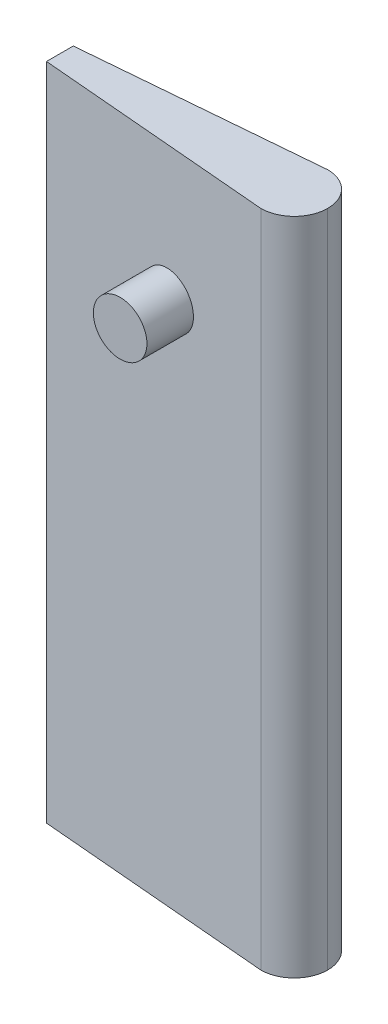
ISO-10303-21;
HEADER;
FILE_DESCRIPTION(('STEP AP214'),'2;1');
FILE_NAME('part.step','',(''),(''),'','','');
FILE_SCHEMA(('AUTOMOTIVE_DESIGN { 1 0 10303 214 1 1 1 1 }'));
ENDSEC;
DATA;
#1=APPLICATION_CONTEXT('core data for automotive mechanical design processes');
#2=APPLICATION_PROTOCOL_DEFINITION('international standard','automotive_design',2000,#1);
#3=PRODUCT_CONTEXT('',#1,'mechanical');
#4=PRODUCT('Part','Part','',(#3));
#5=PRODUCT_RELATED_PRODUCT_CATEGORY('part','',(#4));
#6=PRODUCT_DEFINITION_FORMATION('','',#4);
#7=PRODUCT_DEFINITION_CONTEXT('part definition',#1,'design');
#8=PRODUCT_DEFINITION('design','',#6,#7);
#9=PRODUCT_DEFINITION_SHAPE('','',#8);
#10=(LENGTH_UNIT() NAMED_UNIT(*) SI_UNIT(.MILLI.,.METRE.));
#11=(NAMED_UNIT(*) PLANE_ANGLE_UNIT() SI_UNIT($,.RADIAN.));
#12=(NAMED_UNIT(*) SI_UNIT($,.STERADIAN.) SOLID_ANGLE_UNIT());
#13=UNCERTAINTY_MEASURE_WITH_UNIT(LENGTH_MEASURE(1.E-05),#10,'distance_accuracy_value','');
#14=(GEOMETRIC_REPRESENTATION_CONTEXT(3) GLOBAL_UNCERTAINTY_ASSIGNED_CONTEXT((#13)) GLOBAL_UNIT_ASSIGNED_CONTEXT((#10,
#11,#12)) REPRESENTATION_CONTEXT('',''));
#15=CARTESIAN_POINT('',(0.,0.,0.));
#16=DIRECTION('',(0.,0.,1.));
#17=DIRECTION('',(1.,0.,0.));
#18=AXIS2_PLACEMENT_3D('',#15,#16,#17);
#19=CARTESIAN_POINT('',(-10.,0.,2.5));
#20=DIRECTION('',(0.,1.,0.));
#21=DIRECTION('',(-1.,0.,0.));
#22=AXIS2_PLACEMENT_3D('',#19,#20,#21);
#23=PLANE('',#22);
#24=DIRECTION('',(-0.996346649041751,0.,0.0854011413464362));
#25=VECTOR('',#24,1.);
#26=CARTESIAN_POINT('',(-0.158022690437602,0.,-1.84359805510534));
#27=LINE('',#26,#25);
#28=CARTESIAN_POINT('',(7.50000000000002,0.,-2.5));
#29=VERTEX_POINT('',#28);
#30=CARTESIAN_POINT('',(-10.,0.,-0.999999999999992));
#31=VERTEX_POINT('',#30);
#32=EDGE_CURVE('E63',#29,#31,#27,.T.);
#33=ORIENTED_EDGE('',*,*,#32,.F.);
#34=CARTESIAN_POINT('',(7.5,0.,0.));
#35=DIRECTION('',(0.,1.,0.));
#36=DIRECTION('',(-1.,0.,0.));
#37=AXIS2_PLACEMENT_3D('',#34,#35,#36);
#38=CIRCLE('',#37,2.5);
#39=CARTESIAN_POINT('',(10.,0.,0.));
#40=VERTEX_POINT('',#39);
#41=EDGE_CURVE('E48',#29,#40,#38,.F.);
#42=ORIENTED_EDGE('',*,*,#41,.T.);
#43=CARTESIAN_POINT('',(7.5,0.,0.));
#44=DIRECTION('',(0.,1.,0.));
#45=DIRECTION('',(-1.,0.,0.));
#46=AXIS2_PLACEMENT_3D('',#43,#44,#45);
#47=CIRCLE('',#46,2.5);
#48=CARTESIAN_POINT('',(7.50000000000002,0.,2.5));
#49=VERTEX_POINT('',#48);
#50=EDGE_CURVE('E93',#40,#49,#47,.F.);
#51=ORIENTED_EDGE('',*,*,#50,.T.);
#52=DIRECTION('',(0.996346649041751,0.,0.0854011413464352));
#53=VECTOR('',#52,1.);
#54=CARTESIAN_POINT('',(-0.1580226904376,0.,1.84359805510535));
#55=LINE('',#54,#53);
#56=CARTESIAN_POINT('',(-9.99999999999998,0.,1.00000000000001));
#57=VERTEX_POINT('',#56);
#58=EDGE_CURVE('E116',#57,#49,#55,.T.);
#59=ORIENTED_EDGE('',*,*,#58,.F.);
#60=DIRECTION('',(0.,0.,-1.));
#61=VECTOR('',#60,1.);
#62=CARTESIAN_POINT('',(-10.,0.,2.5));
#63=LINE('',#62,#61);
#64=EDGE_CURVE('E105',#57,#31,#63,.T.);
#65=ORIENTED_EDGE('',*,*,#64,.T.);
#66=EDGE_LOOP('',(#33,#42,#51,#59,#65));
#67=FACE_BOUND('',#66,.T.);
#68=ADVANCED_FACE('F39',(#67),#23,.F.);
#69=CARTESIAN_POINT('',(-10.,0.,2.5));
#70=DIRECTION('',(1.,0.,0.));
#71=DIRECTION('',(0.,1.,0.));
#72=AXIS2_PLACEMENT_3D('',#69,#70,#71);
#73=PLANE('',#72);
#74=DIRECTION('',(0.,1.,0.));
#75=VECTOR('',#74,1.);
#76=CARTESIAN_POINT('',(-9.99999999999998,0.,-0.999999999999992));
#77=LINE('',#76,#75);
#78=CARTESIAN_POINT('',(-9.99999999999998,49.25,-0.999999999999992));
#79=VERTEX_POINT('',#78);
#80=EDGE_CURVE('E101',#31,#79,#77,.T.);
#81=ORIENTED_EDGE('',*,*,#80,.F.);
#82=ORIENTED_EDGE('',*,*,#64,.F.);
#83=DIRECTION('',(0.,1.,0.));
#84=VECTOR('',#83,1.);
#85=CARTESIAN_POINT('',(-9.99999999999998,0.,1.00000000000001));
#86=LINE('',#85,#84);
#87=CARTESIAN_POINT('',(-9.99999999999998,49.25,1.00000000000001));
#88=VERTEX_POINT('',#87);
#89=EDGE_CURVE('E117',#57,#88,#86,.T.);
#90=ORIENTED_EDGE('',*,*,#89,.T.);
#91=DIRECTION('',(0.,0.,-1.));
#92=VECTOR('',#91,1.);
#93=CARTESIAN_POINT('',(-9.99999999999998,49.25,2.5));
#94=LINE('',#93,#92);
#95=EDGE_CURVE('E111',#88,#79,#94,.T.);
#96=ORIENTED_EDGE('',*,*,#95,.T.);
#97=EDGE_LOOP('',(#81,#82,#90,#96));
#98=FACE_BOUND('',#97,.T.);
#99=ADVANCED_FACE('F135',(#98),#73,.F.);
#100=CARTESIAN_POINT('',(-9.99999999999998,49.25,2.5));
#101=DIRECTION('',(0.,-1.,0.));
#102=DIRECTION('',(0.,0.,-1.));
#103=AXIS2_PLACEMENT_3D('',#100,#101,#102);
#104=PLANE('',#103);
#105=CARTESIAN_POINT('',(7.50000000000002,49.25,0.));
#106=DIRECTION('',(0.,-1.,0.));
#107=DIRECTION('',(0.,0.,-1.));
#108=AXIS2_PLACEMENT_3D('',#105,#106,#107);
#109=CIRCLE('',#108,2.5);
#110=CARTESIAN_POINT('',(10.,49.25,0.));
#111=VERTEX_POINT('',#110);
#112=CARTESIAN_POINT('',(7.50000000000002,49.25,-2.5));
#113=VERTEX_POINT('',#112);
#114=EDGE_CURVE('E92',#111,#113,#109,.F.);
#115=ORIENTED_EDGE('',*,*,#114,.T.);
#116=DIRECTION('',(-0.996346649041751,0.,0.0854011413464362));
#117=VECTOR('',#116,1.);
#118=CARTESIAN_POINT('',(-0.158022690437602,49.25,-1.84359805510534));
#119=LINE('',#118,#117);
#120=EDGE_CURVE('E90',#113,#79,#119,.T.);
#121=ORIENTED_EDGE('',*,*,#120,.T.);
#122=ORIENTED_EDGE('',*,*,#95,.F.);
#123=DIRECTION('',(0.996346649041751,0.,0.0854011413464352));
#124=VECTOR('',#123,1.);
#125=CARTESIAN_POINT('',(-0.1580226904376,49.25,1.84359805510535));
#126=LINE('',#125,#124);
#127=CARTESIAN_POINT('',(7.50000000000002,49.25,2.5));
#128=VERTEX_POINT('',#127);
#129=EDGE_CURVE('E54',#88,#128,#126,.T.);
#130=ORIENTED_EDGE('',*,*,#129,.T.);
#131=CARTESIAN_POINT('',(7.50000000000002,49.25,0.));
#132=DIRECTION('',(0.,-1.,0.));
#133=DIRECTION('',(0.,0.,-1.));
#134=AXIS2_PLACEMENT_3D('',#131,#132,#133);
#135=CIRCLE('',#134,2.5);
#136=EDGE_CURVE('E121',#128,#111,#135,.F.);
#137=ORIENTED_EDGE('',*,*,#136,.T.);
#138=EDGE_LOOP('',(#115,#121,#122,#130,#137));
#139=FACE_BOUND('',#138,.T.);
#140=ADVANCED_FACE('F130',(#139),#104,.F.);
#141=CARTESIAN_POINT('',(7.5,0.,0.));
#142=DIRECTION('',(0.,-1.,0.));
#143=DIRECTION('',(1.,0.,0.));
#144=AXIS2_PLACEMENT_3D('',#141,#142,#143);
#145=CYLINDRICAL_SURFACE('',#144,2.5);
#146=DIRECTION('',(0.,1.,0.));
#147=VECTOR('',#146,1.);
#148=CARTESIAN_POINT('',(7.50000000000002,49.25,2.5));
#149=LINE('',#148,#147);
#150=EDGE_CURVE('E11',#49,#128,#149,.T.);
#151=ORIENTED_EDGE('',*,*,#150,.F.);
#152=ORIENTED_EDGE('',*,*,#50,.F.);
#153=DIRECTION('',(0.,1.,0.));
#154=VECTOR('',#153,1.);
#155=CARTESIAN_POINT('',(10.,0.,0.));
#156=LINE('',#155,#154);
#157=EDGE_CURVE('E108',#111,#40,#156,.F.);
#158=ORIENTED_EDGE('',*,*,#157,.F.);
#159=ORIENTED_EDGE('',*,*,#136,.F.);
#160=EDGE_LOOP('',(#151,#152,#158,#159));
#161=FACE_BOUND('',#160,.T.);
#162=ADVANCED_FACE('F41',(#161),#145,.T.);
#163=CARTESIAN_POINT('',(7.5,0.,0.));
#164=DIRECTION('',(0.,1.,0.));
#165=DIRECTION('',(-1.,0.,0.));
#166=AXIS2_PLACEMENT_3D('',#163,#164,#165);
#167=CYLINDRICAL_SURFACE('',#166,2.5);
#168=ORIENTED_EDGE('',*,*,#41,.F.);
#169=DIRECTION('',(0.,1.,0.));
#170=VECTOR('',#169,1.);
#171=CARTESIAN_POINT('',(7.5,0.,-2.5));
#172=LINE('',#171,#170);
#173=EDGE_CURVE('E81',#113,#29,#172,.F.);
#174=ORIENTED_EDGE('',*,*,#173,.F.);
#175=ORIENTED_EDGE('',*,*,#114,.F.);
#176=ORIENTED_EDGE('',*,*,#157,.T.);
#177=EDGE_LOOP('',(#168,#174,#175,#176));
#178=FACE_BOUND('',#177,.T.);
#179=ADVANCED_FACE('F106',(#178),#167,.T.);
#180=CARTESIAN_POINT('',(-0.1580226904376,0.,1.84359805510535));
#181=DIRECTION('',(-0.0854011413464352,0.,0.996346649041751));
#182=DIRECTION('',(0.996346649041751,0.,0.0854011413464352));
#183=AXIS2_PLACEMENT_3D('',#180,#181,#182);
#184=PLANE('',#183);
#185=CARTESIAN_POINT('',(0.,39.25,1.85714285714286));
#186=DIRECTION('',(-0.0854011413464352,0.,0.996346649041751));
#187=DIRECTION('',(-0.996346649041751,0.,-0.0854011413464352));
#188=AXIS2_PLACEMENT_3D('',#185,#186,#187);
#189=ELLIPSE('',#188,2.00733349374289,2.);
#190=CARTESIAN_POINT('',(-2.,39.25,1.68571428571429));
#191=VERTEX_POINT('',#190);
#192=EDGE_CURVE('E119',#191,#191,#189,.F.);
#193=ORIENTED_EDGE('',*,*,#192,.T.);
#194=EDGE_LOOP('',(#193));
#195=FACE_BOUND('',#194,.T.);
#196=ORIENTED_EDGE('',*,*,#129,.F.);
#197=ORIENTED_EDGE('',*,*,#89,.F.);
#198=ORIENTED_EDGE('',*,*,#58,.T.);
#199=ORIENTED_EDGE('',*,*,#150,.T.);
#200=EDGE_LOOP('',(#196,#197,#198,#199));
#201=FACE_BOUND('',#200,.T.);
#202=ADVANCED_FACE('F131',(#195,#201),#184,.T.);
#203=CARTESIAN_POINT('',(-0.158022690437602,0.,-1.84359805510534));
#204=DIRECTION('',(-0.0854011413464362,0.,-0.996346649041751));
#205=DIRECTION('',(-0.996346649041751,0.,0.0854011413464362));
#206=AXIS2_PLACEMENT_3D('',#203,#204,#205);
#207=PLANE('',#206);
#208=CARTESIAN_POINT('',(0.,39.25,-1.85714285714285));
#209=DIRECTION('',(-0.0854011413464362,0.,-0.996346649041751));
#210=DIRECTION('',(0.996346649041751,0.,-0.0854011413464362));
#211=AXIS2_PLACEMENT_3D('',#208,#209,#210);
#212=ELLIPSE('',#211,2.00733349374289,2.);
#213=CARTESIAN_POINT('',(2.,39.25,-2.02857142857143));
#214=VERTEX_POINT('',#213);
#215=EDGE_CURVE('E43',#214,#214,#212,.F.);
#216=ORIENTED_EDGE('',*,*,#215,.T.);
#217=EDGE_LOOP('',(#216));
#218=FACE_BOUND('',#217,.T.);
#219=ORIENTED_EDGE('',*,*,#120,.F.);
#220=ORIENTED_EDGE('',*,*,#173,.T.);
#221=ORIENTED_EDGE('',*,*,#32,.T.);
#222=ORIENTED_EDGE('',*,*,#80,.T.);
#223=EDGE_LOOP('',(#219,#220,#221,#222));
#224=FACE_BOUND('',#223,.T.);
#225=ADVANCED_FACE('F87',(#218,#224),#207,.T.);
#226=CARTESIAN_POINT('',(0.,39.25,-5.5));
#227=DIRECTION('',(0.,0.,1.));
#228=DIRECTION('',(1.,0.,0.));
#229=AXIS2_PLACEMENT_3D('',#226,#227,#228);
#230=PLANE('',#229);
#231=CARTESIAN_POINT('',(0.,39.25,-5.5));
#232=DIRECTION('',(0.,0.,1.));
#233=DIRECTION('',(1.,0.,0.));
#234=AXIS2_PLACEMENT_3D('',#231,#232,#233);
#235=CIRCLE('',#234,2.);
#236=CARTESIAN_POINT('',(2.,39.25,-5.5));
#237=VERTEX_POINT('',#236);
#238=EDGE_CURVE('E233',#237,#237,#235,.T.);
#239=ORIENTED_EDGE('',*,*,#238,.F.);
#240=EDGE_LOOP('',(#239));
#241=FACE_BOUND('',#240,.T.);
#242=ADVANCED_FACE('F145',(#241),#230,.F.);
#243=CARTESIAN_POINT('',(0.,39.25,5.5));
#244=DIRECTION('',(0.,0.,-1.));
#245=DIRECTION('',(-1.,0.,0.));
#246=AXIS2_PLACEMENT_3D('',#243,#244,#245);
#247=CYLINDRICAL_SURFACE('',#246,2.);
#248=ORIENTED_EDGE('',*,*,#215,.F.);
#249=EDGE_LOOP('',(#248));
#250=FACE_BOUND('',#249,.T.);
#251=ORIENTED_EDGE('',*,*,#238,.T.);
#252=EDGE_LOOP('',(#251));
#253=FACE_BOUND('',#252,.T.);
#254=ADVANCED_FACE('F191',(#250,#253),#247,.T.);
#255=ORIENTED_EDGE('',*,*,#192,.F.);
#256=EDGE_LOOP('',(#255));
#257=FACE_BOUND('',#256,.T.);
#258=CARTESIAN_POINT('',(0.,39.25,5.5));
#259=DIRECTION('',(0.,0.,1.));
#260=DIRECTION('',(1.,0.,0.));
#261=AXIS2_PLACEMENT_3D('',#258,#259,#260);
#262=CIRCLE('',#261,2.);
#263=CARTESIAN_POINT('',(2.,39.25,5.5));
#264=VERTEX_POINT('',#263);
#265=EDGE_CURVE('E230',#264,#264,#262,.T.);
#266=ORIENTED_EDGE('',*,*,#265,.F.);
#267=EDGE_LOOP('',(#266));
#268=FACE_BOUND('',#267,.T.);
#269=ADVANCED_FACE('F204',(#257,#268),#247,.T.);
#270=CARTESIAN_POINT('',(0.,39.25,5.5));
#271=DIRECTION('',(0.,0.,1.));
#272=DIRECTION('',(1.,0.,0.));
#273=AXIS2_PLACEMENT_3D('',#270,#271,#272);
#274=PLANE('',#273);
#275=ORIENTED_EDGE('',*,*,#265,.T.);
#276=EDGE_LOOP('',(#275));
#277=FACE_BOUND('',#276,.T.);
#278=ADVANCED_FACE('F211',(#277),#274,.T.);
#279=CLOSED_SHELL('',(#68,#99,#140,#162,#179,#202,#225,#242,#254,#269,#278));
#280=MANIFOLD_SOLID_BREP('B2',#279);
#281=ADVANCED_BREP_SHAPE_REPRESENTATION('',(#18,#280),#14);
#282=SHAPE_DEFINITION_REPRESENTATION(#9,#281);
ENDSEC;
END-ISO-10303-21;
